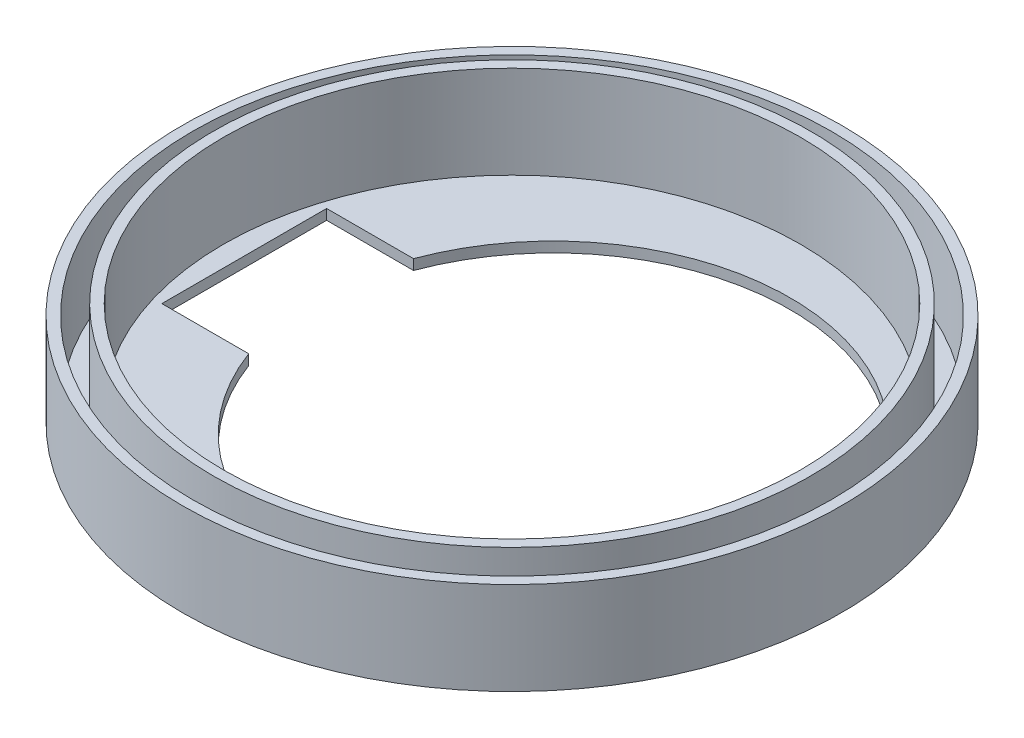
ISO-10303-21;
HEADER;
FILE_DESCRIPTION(('STEP AP214'),'2;1');
FILE_NAME('part.step','',(''),(''),'','','');
FILE_SCHEMA(('AUTOMOTIVE_DESIGN { 1 0 10303 214 1 1 1 1 }'));
ENDSEC;
DATA;
#1=APPLICATION_CONTEXT('core data for automotive mechanical design processes');
#2=APPLICATION_PROTOCOL_DEFINITION('international standard','automotive_design',2000,#1);
#3=PRODUCT_CONTEXT('',#1,'mechanical');
#4=PRODUCT('Part','Part','',(#3));
#5=PRODUCT_RELATED_PRODUCT_CATEGORY('part','',(#4));
#6=PRODUCT_DEFINITION_FORMATION('','',#4);
#7=PRODUCT_DEFINITION_CONTEXT('part definition',#1,'design');
#8=PRODUCT_DEFINITION('design','',#6,#7);
#9=PRODUCT_DEFINITION_SHAPE('','',#8);
#10=(LENGTH_UNIT() NAMED_UNIT(*) SI_UNIT(.MILLI.,.METRE.));
#11=(NAMED_UNIT(*) PLANE_ANGLE_UNIT() SI_UNIT($,.RADIAN.));
#12=(NAMED_UNIT(*) SI_UNIT($,.STERADIAN.) SOLID_ANGLE_UNIT());
#13=UNCERTAINTY_MEASURE_WITH_UNIT(LENGTH_MEASURE(1.E-05),#10,'distance_accuracy_value','');
#14=(GEOMETRIC_REPRESENTATION_CONTEXT(3) GLOBAL_UNCERTAINTY_ASSIGNED_CONTEXT((#13)) GLOBAL_UNIT_ASSIGNED_CONTEXT((#10,
#11,#12)) REPRESENTATION_CONTEXT('',''));
#15=CARTESIAN_POINT('',(0.,0.,0.));
#16=DIRECTION('',(0.,0.,1.));
#17=DIRECTION('',(1.,0.,0.));
#18=AXIS2_PLACEMENT_3D('',#15,#16,#17);
#19=CARTESIAN_POINT('',(0.,0.5,0.));
#20=DIRECTION('',(0.,1.,0.));
#21=DIRECTION('',(0.,0.,1.));
#22=AXIS2_PLACEMENT_3D('',#19,#20,#21);
#23=PLANE('',#22);
#24=DIRECTION('',(0.,0.,-1.));
#25=VECTOR('',#24,1.);
#26=CARTESIAN_POINT('',(-13.,0.5,0.));
#27=LINE('',#26,#25);
#28=CARTESIAN_POINT('',(-13.,0.5,4.));
#29=VERTEX_POINT('',#28);
#30=CARTESIAN_POINT('',(-13.,0.5,-4.));
#31=VERTEX_POINT('',#30);
#32=EDGE_CURVE('E112',#29,#31,#27,.T.);
#33=ORIENTED_EDGE('',*,*,#32,.T.);
#34=DIRECTION('',(1.,0.,0.));
#35=VECTOR('',#34,1.);
#36=CARTESIAN_POINT('',(0.,0.5,-4.));
#37=LINE('',#36,#35);
#38=CARTESIAN_POINT('',(-8.78192932642392,0.5,-4.));
#39=VERTEX_POINT('',#38);
#40=EDGE_CURVE('E84',#31,#39,#37,.T.);
#41=ORIENTED_EDGE('',*,*,#40,.T.);
#42=CARTESIAN_POINT('',(2.,0.5,0.));
#43=DIRECTION('',(0.,1.,0.));
#44=DIRECTION('',(0.,0.,1.));
#45=AXIS2_PLACEMENT_3D('',#42,#43,#44);
#46=CIRCLE('',#45,11.5);
#47=CARTESIAN_POINT('',(-8.78192932642392,0.5,4.));
#48=VERTEX_POINT('',#47);
#49=EDGE_CURVE('E114',#48,#39,#46,.T.);
#50=ORIENTED_EDGE('',*,*,#49,.F.);
#51=DIRECTION('',(-1.,0.,0.));
#52=VECTOR('',#51,1.);
#53=CARTESIAN_POINT('',(0.,0.5,4.));
#54=LINE('',#53,#52);
#55=EDGE_CURVE('E54',#48,#29,#54,.T.);
#56=ORIENTED_EDGE('',*,*,#55,.T.);
#57=EDGE_LOOP('',(#33,#41,#50,#56));
#58=FACE_BOUND('',#57,.T.);
#59=CARTESIAN_POINT('',(0.,0.5,0.));
#60=DIRECTION('',(0.,1.,0.));
#61=DIRECTION('',(0.,0.,1.));
#62=AXIS2_PLACEMENT_3D('',#59,#60,#61);
#63=CIRCLE('',#62,14.);
#64=CARTESIAN_POINT('',(0.,0.5,14.));
#65=VERTEX_POINT('',#64);
#66=EDGE_CURVE('E12',#65,#65,#63,.F.);
#67=ORIENTED_EDGE('',*,*,#66,.F.);
#68=EDGE_LOOP('',(#67));
#69=FACE_BOUND('',#68,.T.);
#70=ADVANCED_FACE('F39',(#58,#69),#23,.T.);
#71=CARTESIAN_POINT('',(0.,0.5,0.));
#72=DIRECTION('',(0.,1.,0.));
#73=DIRECTION('',(0.,0.,1.));
#74=AXIS2_PLACEMENT_3D('',#71,#72,#73);
#75=CIRCLE('',#74,14.5);
#76=CARTESIAN_POINT('',(0.,0.5,14.5));
#77=VERTEX_POINT('',#76);
#78=EDGE_CURVE('E177',#77,#77,#75,.T.);
#79=ORIENTED_EDGE('',*,*,#78,.F.);
#80=EDGE_LOOP('',(#79));
#81=FACE_BOUND('',#80,.T.);
#82=CARTESIAN_POINT('',(0.,0.5,0.));
#83=DIRECTION('',(0.,1.,0.));
#84=DIRECTION('',(0.,0.,1.));
#85=AXIS2_PLACEMENT_3D('',#82,#83,#84);
#86=CIRCLE('',#85,15.5);
#87=CARTESIAN_POINT('',(0.,0.5,15.5));
#88=VERTEX_POINT('',#87);
#89=EDGE_CURVE('E47',#88,#88,#86,.F.);
#90=ORIENTED_EDGE('',*,*,#89,.F.);
#91=EDGE_LOOP('',(#90));
#92=FACE_BOUND('',#91,.T.);
#93=ADVANCED_FACE('F128',(#81,#92),#23,.T.);
#94=CARTESIAN_POINT('',(0.,0.,0.));
#95=DIRECTION('',(0.,1.,0.));
#96=DIRECTION('',(0.,0.,1.));
#97=AXIS2_PLACEMENT_3D('',#94,#95,#96);
#98=PLANE('',#97);
#99=CARTESIAN_POINT('',(0.,0.,0.));
#100=DIRECTION('',(0.,1.,0.));
#101=DIRECTION('',(0.,0.,1.));
#102=AXIS2_PLACEMENT_3D('',#99,#100,#101);
#103=CIRCLE('',#102,16.);
#104=CARTESIAN_POINT('',(0.,0.,16.));
#105=VERTEX_POINT('',#104);
#106=EDGE_CURVE('E116',#105,#105,#103,.T.);
#107=ORIENTED_EDGE('',*,*,#106,.F.);
#108=EDGE_LOOP('',(#107));
#109=FACE_BOUND('',#108,.T.);
#110=DIRECTION('',(-1.,0.,0.));
#111=VECTOR('',#110,1.);
#112=CARTESIAN_POINT('',(2.,0.,-4.));
#113=LINE('',#112,#111);
#114=CARTESIAN_POINT('',(-8.78192932642392,0.,-4.));
#115=VERTEX_POINT('',#114);
#116=CARTESIAN_POINT('',(-13.,0.,-4.));
#117=VERTEX_POINT('',#116);
#118=EDGE_CURVE('E83',#115,#117,#113,.T.);
#119=ORIENTED_EDGE('',*,*,#118,.T.);
#120=DIRECTION('',(0.,0.,1.));
#121=VECTOR('',#120,1.);
#122=CARTESIAN_POINT('',(-13.,0.,-4.));
#123=LINE('',#122,#121);
#124=CARTESIAN_POINT('',(-13.,0.,4.));
#125=VERTEX_POINT('',#124);
#126=EDGE_CURVE('E90',#117,#125,#123,.T.);
#127=ORIENTED_EDGE('',*,*,#126,.T.);
#128=DIRECTION('',(1.,0.,0.));
#129=VECTOR('',#128,1.);
#130=CARTESIAN_POINT('',(2.,0.,4.));
#131=LINE('',#130,#129);
#132=CARTESIAN_POINT('',(-8.78192932642391,0.,4.));
#133=VERTEX_POINT('',#132);
#134=EDGE_CURVE('E95',#125,#133,#131,.T.);
#135=ORIENTED_EDGE('',*,*,#134,.T.);
#136=CARTESIAN_POINT('',(2.,0.,0.));
#137=DIRECTION('',(0.,1.,0.));
#138=DIRECTION('',(0.,0.,1.));
#139=AXIS2_PLACEMENT_3D('',#136,#137,#138);
#140=CIRCLE('',#139,11.5);
#141=EDGE_CURVE('E100',#133,#115,#140,.T.);
#142=ORIENTED_EDGE('',*,*,#141,.T.);
#143=EDGE_LOOP('',(#119,#127,#135,#142));
#144=FACE_BOUND('',#143,.T.);
#145=ADVANCED_FACE('F98',(#109,#144),#98,.F.);
#146=CARTESIAN_POINT('',(2.,0.,0.));
#147=DIRECTION('',(0.,1.,0.));
#148=DIRECTION('',(0.,0.,1.));
#149=AXIS2_PLACEMENT_3D('',#146,#147,#148);
#150=CYLINDRICAL_SURFACE('',#149,11.5);
#151=DIRECTION('',(0.,1.,0.));
#152=VECTOR('',#151,1.);
#153=CARTESIAN_POINT('',(-8.78192932642392,0.,-4.));
#154=LINE('',#153,#152);
#155=EDGE_CURVE('E62',#115,#39,#154,.T.);
#156=ORIENTED_EDGE('',*,*,#155,.F.);
#157=ORIENTED_EDGE('',*,*,#141,.F.);
#158=DIRECTION('',(0.,1.,0.));
#159=VECTOR('',#158,1.);
#160=CARTESIAN_POINT('',(-8.78192932642392,0.,4.));
#161=LINE('',#160,#159);
#162=EDGE_CURVE('E121',#48,#133,#161,.F.);
#163=ORIENTED_EDGE('',*,*,#162,.F.);
#164=ORIENTED_EDGE('',*,*,#49,.T.);
#165=EDGE_LOOP('',(#156,#157,#163,#164));
#166=FACE_BOUND('',#165,.T.);
#167=ADVANCED_FACE('F136',(#166),#150,.F.);
#168=CARTESIAN_POINT('',(0.,0.5,0.));
#169=DIRECTION('',(0.,-1.,0.));
#170=DIRECTION('',(0.,0.,-1.));
#171=AXIS2_PLACEMENT_3D('',#168,#169,#170);
#172=CYLINDRICAL_SURFACE('',#171,16.);
#173=ORIENTED_EDGE('',*,*,#106,.T.);
#174=EDGE_LOOP('',(#173));
#175=FACE_BOUND('',#174,.T.);
#176=CARTESIAN_POINT('',(0.,4.5,0.));
#177=DIRECTION('',(0.,1.,0.));
#178=DIRECTION('',(0.,0.,1.));
#179=AXIS2_PLACEMENT_3D('',#176,#177,#178);
#180=CIRCLE('',#179,16.);
#181=CARTESIAN_POINT('',(0.,4.5,16.));
#182=VERTEX_POINT('',#181);
#183=EDGE_CURVE('E101',#182,#182,#180,.T.);
#184=ORIENTED_EDGE('',*,*,#183,.F.);
#185=EDGE_LOOP('',(#184));
#186=FACE_BOUND('',#185,.T.);
#187=ADVANCED_FACE('F41',(#175,#186),#172,.T.);
#188=CARTESIAN_POINT('',(2.,2.5,-4.));
#189=DIRECTION('',(0.,0.,1.));
#190=DIRECTION('',(1.,0.,0.));
#191=AXIS2_PLACEMENT_3D('',#188,#189,#190);
#192=PLANE('',#191);
#193=DIRECTION('',(0.,-1.,0.));
#194=VECTOR('',#193,1.);
#195=CARTESIAN_POINT('',(-13.,2.5,-4.));
#196=LINE('',#195,#194);
#197=EDGE_CURVE('E79',#31,#117,#196,.T.);
#198=ORIENTED_EDGE('',*,*,#197,.T.);
#199=ORIENTED_EDGE('',*,*,#118,.F.);
#200=ORIENTED_EDGE('',*,*,#155,.T.);
#201=ORIENTED_EDGE('',*,*,#40,.F.);
#202=EDGE_LOOP('',(#198,#199,#200,#201));
#203=FACE_BOUND('',#202,.T.);
#204=ADVANCED_FACE('F81',(#203),#192,.T.);
#205=CARTESIAN_POINT('',(-13.,2.5,-4.));
#206=DIRECTION('',(1.,0.,0.));
#207=DIRECTION('',(0.,0.,-1.));
#208=AXIS2_PLACEMENT_3D('',#205,#206,#207);
#209=PLANE('',#208);
#210=DIRECTION('',(0.,-1.,0.));
#211=VECTOR('',#210,1.);
#212=CARTESIAN_POINT('',(-13.,2.5,4.));
#213=LINE('',#212,#211);
#214=EDGE_CURVE('E87',#29,#125,#213,.T.);
#215=ORIENTED_EDGE('',*,*,#214,.T.);
#216=ORIENTED_EDGE('',*,*,#126,.F.);
#217=ORIENTED_EDGE('',*,*,#197,.F.);
#218=ORIENTED_EDGE('',*,*,#32,.F.);
#219=EDGE_LOOP('',(#215,#216,#217,#218));
#220=FACE_BOUND('',#219,.T.);
#221=ADVANCED_FACE('F91',(#220),#209,.T.);
#222=CARTESIAN_POINT('',(2.,2.5,4.));
#223=DIRECTION('',(0.,0.,-1.));
#224=DIRECTION('',(-1.,0.,0.));
#225=AXIS2_PLACEMENT_3D('',#222,#223,#224);
#226=PLANE('',#225);
#227=ORIENTED_EDGE('',*,*,#162,.T.);
#228=ORIENTED_EDGE('',*,*,#134,.F.);
#229=ORIENTED_EDGE('',*,*,#214,.F.);
#230=ORIENTED_EDGE('',*,*,#55,.F.);
#231=EDGE_LOOP('',(#227,#228,#229,#230));
#232=FACE_BOUND('',#231,.T.);
#233=ADVANCED_FACE('F148',(#232),#226,.T.);
#234=CARTESIAN_POINT('',(0.,4.5,0.));
#235=DIRECTION('',(0.,1.,0.));
#236=DIRECTION('',(0.,0.,1.));
#237=AXIS2_PLACEMENT_3D('',#234,#235,#236);
#238=PLANE('',#237);
#239=ORIENTED_EDGE('',*,*,#183,.T.);
#240=EDGE_LOOP('',(#239));
#241=FACE_BOUND('',#240,.T.);
#242=CARTESIAN_POINT('',(0.,4.5,0.));
#243=DIRECTION('',(0.,1.,0.));
#244=DIRECTION('',(0.,0.,1.));
#245=AXIS2_PLACEMENT_3D('',#242,#243,#244);
#246=CIRCLE('',#245,15.5);
#247=CARTESIAN_POINT('',(0.,4.5,15.5));
#248=VERTEX_POINT('',#247);
#249=EDGE_CURVE('E104',#248,#248,#246,.T.);
#250=ORIENTED_EDGE('',*,*,#249,.F.);
#251=EDGE_LOOP('',(#250));
#252=FACE_BOUND('',#251,.T.);
#253=ADVANCED_FACE('F151',(#241,#252),#238,.T.);
#254=CARTESIAN_POINT('',(0.,4.5,0.));
#255=DIRECTION('',(0.,-1.,0.));
#256=DIRECTION('',(0.,0.,-1.));
#257=AXIS2_PLACEMENT_3D('',#254,#255,#256);
#258=CYLINDRICAL_SURFACE('',#257,15.5);
#259=ORIENTED_EDGE('',*,*,#89,.T.);
#260=EDGE_LOOP('',(#259));
#261=FACE_BOUND('',#260,.T.);
#262=ORIENTED_EDGE('',*,*,#249,.T.);
#263=EDGE_LOOP('',(#262));
#264=FACE_BOUND('',#263,.T.);
#265=ADVANCED_FACE('F125',(#261,#264),#258,.F.);
#266=CARTESIAN_POINT('',(0.,5.,0.));
#267=DIRECTION('',(0.,1.,0.));
#268=DIRECTION('',(0.,0.,1.));
#269=AXIS2_PLACEMENT_3D('',#266,#267,#268);
#270=PLANE('',#269);
#271=CARTESIAN_POINT('',(0.,5.,0.));
#272=DIRECTION('',(0.,1.,0.));
#273=DIRECTION('',(0.,0.,1.));
#274=AXIS2_PLACEMENT_3D('',#271,#272,#273);
#275=CIRCLE('',#274,14.5);
#276=CARTESIAN_POINT('',(0.,5.,14.5));
#277=VERTEX_POINT('',#276);
#278=EDGE_CURVE('E180',#277,#277,#275,.T.);
#279=ORIENTED_EDGE('',*,*,#278,.T.);
#280=EDGE_LOOP('',(#279));
#281=FACE_BOUND('',#280,.T.);
#282=CARTESIAN_POINT('',(0.,5.,0.));
#283=DIRECTION('',(0.,1.,0.));
#284=DIRECTION('',(0.,0.,1.));
#285=AXIS2_PLACEMENT_3D('',#282,#283,#284);
#286=CIRCLE('',#285,14.);
#287=CARTESIAN_POINT('',(0.,5.,14.));
#288=VERTEX_POINT('',#287);
#289=EDGE_CURVE('E173',#288,#288,#286,.T.);
#290=ORIENTED_EDGE('',*,*,#289,.F.);
#291=EDGE_LOOP('',(#290));
#292=FACE_BOUND('',#291,.T.);
#293=ADVANCED_FACE('F157',(#281,#292),#270,.T.);
#294=CARTESIAN_POINT('',(0.,5.,0.));
#295=DIRECTION('',(0.,-1.,0.));
#296=DIRECTION('',(0.,0.,-1.));
#297=AXIS2_PLACEMENT_3D('',#294,#295,#296);
#298=CYLINDRICAL_SURFACE('',#297,14.5);
#299=ORIENTED_EDGE('',*,*,#278,.F.);
#300=EDGE_LOOP('',(#299));
#301=FACE_BOUND('',#300,.T.);
#302=ORIENTED_EDGE('',*,*,#78,.T.);
#303=EDGE_LOOP('',(#302));
#304=FACE_BOUND('',#303,.T.);
#305=ADVANCED_FACE('F158',(#301,#304),#298,.T.);
#306=CARTESIAN_POINT('',(0.,5.,0.));
#307=DIRECTION('',(0.,-1.,0.));
#308=DIRECTION('',(0.,0.,-1.));
#309=AXIS2_PLACEMENT_3D('',#306,#307,#308);
#310=CYLINDRICAL_SURFACE('',#309,14.);
#311=ORIENTED_EDGE('',*,*,#289,.T.);
#312=EDGE_LOOP('',(#311));
#313=FACE_BOUND('',#312,.T.);
#314=ORIENTED_EDGE('',*,*,#66,.T.);
#315=EDGE_LOOP('',(#314));
#316=FACE_BOUND('',#315,.T.);
#317=ADVANCED_FACE('F161',(#313,#316),#310,.F.);
#318=CLOSED_SHELL('',(#70,#93,#145,#167,#187,#204,#221,#233,#253,#265,#293,#305,#317));
#319=MANIFOLD_SOLID_BREP('B2',#318);
#320=ADVANCED_BREP_SHAPE_REPRESENTATION('',(#18,#319),#14);
#321=SHAPE_DEFINITION_REPRESENTATION(#9,#320);
ENDSEC;
END-ISO-10303-21;
